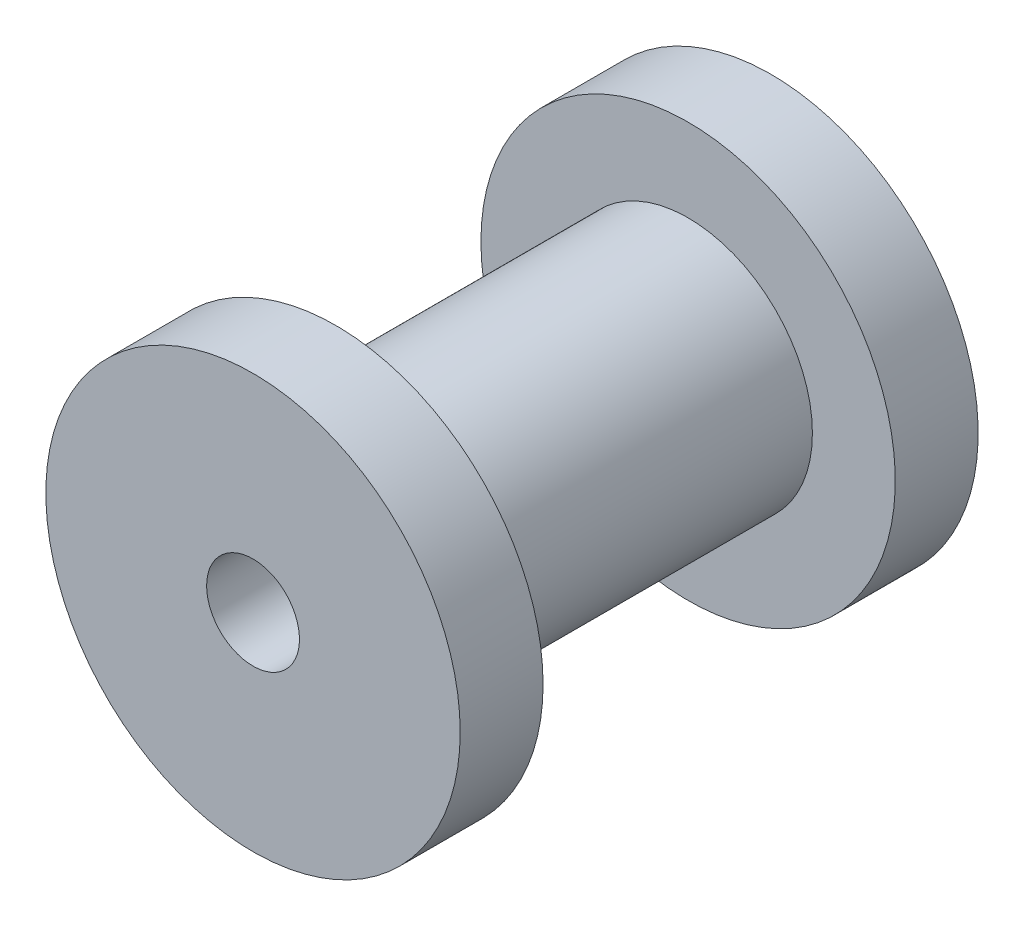
ISO-10303-21;
HEADER;
FILE_DESCRIPTION(('STEP AP214'),'2;1');
FILE_NAME('part.step','',(''),(''),'','','');
FILE_SCHEMA(('AUTOMOTIVE_DESIGN { 1 0 10303 214 1 1 1 1 }'));
ENDSEC;
DATA;
#1=APPLICATION_CONTEXT('core data for automotive mechanical design processes');
#2=APPLICATION_PROTOCOL_DEFINITION('international standard','automotive_design',2000,#1);
#3=PRODUCT_CONTEXT('',#1,'mechanical');
#4=PRODUCT('Part','Part','',(#3));
#5=PRODUCT_RELATED_PRODUCT_CATEGORY('part','',(#4));
#6=PRODUCT_DEFINITION_FORMATION('','',#4);
#7=PRODUCT_DEFINITION_CONTEXT('part definition',#1,'design');
#8=PRODUCT_DEFINITION('design','',#6,#7);
#9=PRODUCT_DEFINITION_SHAPE('','',#8);
#10=(LENGTH_UNIT() NAMED_UNIT(*) SI_UNIT(.MILLI.,.METRE.));
#11=(NAMED_UNIT(*) PLANE_ANGLE_UNIT() SI_UNIT($,.RADIAN.));
#12=(NAMED_UNIT(*) SI_UNIT($,.STERADIAN.) SOLID_ANGLE_UNIT());
#13=UNCERTAINTY_MEASURE_WITH_UNIT(LENGTH_MEASURE(1.E-05),#10,'distance_accuracy_value','');
#14=(GEOMETRIC_REPRESENTATION_CONTEXT(3) GLOBAL_UNCERTAINTY_ASSIGNED_CONTEXT((#13)) GLOBAL_UNIT_ASSIGNED_CONTEXT((#10,
#11,#12)) REPRESENTATION_CONTEXT('',''));
#15=CARTESIAN_POINT('',(0.,0.,0.));
#16=DIRECTION('',(0.,0.,1.));
#17=DIRECTION('',(1.,0.,0.));
#18=AXIS2_PLACEMENT_3D('',#15,#16,#17);
#19=CARTESIAN_POINT('',(0.,0.,26.9875));
#20=DIRECTION('',(0.,0.,-1.));
#21=DIRECTION('',(-1.,0.,0.));
#22=AXIS2_PLACEMENT_3D('',#19,#20,#21);
#23=CYLINDRICAL_SURFACE('',#22,9.525);
#24=CARTESIAN_POINT('',(0.,0.,26.9875));
#25=DIRECTION('',(0.,0.,1.));
#26=DIRECTION('',(1.,0.,0.));
#27=AXIS2_PLACEMENT_3D('',#24,#25,#26);
#28=CIRCLE('',#27,9.525);
#29=CARTESIAN_POINT('',(9.525,0.,26.9875));
#30=VERTEX_POINT('',#29);
#31=EDGE_CURVE('E10',#30,#30,#28,.T.);
#32=ORIENTED_EDGE('',*,*,#31,.F.);
#33=EDGE_LOOP('',(#32));
#34=FACE_BOUND('',#33,.T.);
#35=CARTESIAN_POINT('',(0.,0.,0.));
#36=DIRECTION('',(0.,0.,1.));
#37=DIRECTION('',(1.,0.,0.));
#38=AXIS2_PLACEMENT_3D('',#35,#36,#37);
#39=CIRCLE('',#38,9.525);
#40=CARTESIAN_POINT('',(9.525,0.,0.));
#41=VERTEX_POINT('',#40);
#42=EDGE_CURVE('E40',#41,#41,#39,.T.);
#43=ORIENTED_EDGE('',*,*,#42,.T.);
#44=EDGE_LOOP('',(#43));
#45=FACE_BOUND('',#44,.T.);
#46=ADVANCED_FACE('F37',(#34,#45),#23,.T.);
#47=CARTESIAN_POINT('',(0.,0.,33.3375));
#48=DIRECTION('',(0.,0.,-1.));
#49=DIRECTION('',(-1.,0.,0.));
#50=AXIS2_PLACEMENT_3D('',#47,#48,#49);
#51=CYLINDRICAL_SURFACE('',#50,15.875);
#52=CARTESIAN_POINT('',(0.,0.,33.3375));
#53=DIRECTION('',(0.,0.,1.));
#54=DIRECTION('',(1.,0.,0.));
#55=AXIS2_PLACEMENT_3D('',#52,#53,#54);
#56=CIRCLE('',#55,15.875);
#57=CARTESIAN_POINT('',(15.875,0.,33.3375));
#58=VERTEX_POINT('',#57);
#59=EDGE_CURVE('E45',#58,#58,#56,.T.);
#60=ORIENTED_EDGE('',*,*,#59,.F.);
#61=EDGE_LOOP('',(#60));
#62=FACE_BOUND('',#61,.T.);
#63=CARTESIAN_POINT('',(0.,0.,26.9875));
#64=DIRECTION('',(0.,0.,1.));
#65=DIRECTION('',(1.,0.,0.));
#66=AXIS2_PLACEMENT_3D('',#63,#64,#65);
#67=CIRCLE('',#66,15.875);
#68=CARTESIAN_POINT('',(15.875,0.,26.9875));
#69=VERTEX_POINT('',#68);
#70=EDGE_CURVE('E50',#69,#69,#67,.T.);
#71=ORIENTED_EDGE('',*,*,#70,.T.);
#72=EDGE_LOOP('',(#71));
#73=FACE_BOUND('',#72,.T.);
#74=ADVANCED_FACE('F103',(#62,#73),#51,.T.);
#75=CARTESIAN_POINT('',(0.,0.,33.3375));
#76=DIRECTION('',(0.,0.,1.));
#77=DIRECTION('',(1.,0.,0.));
#78=AXIS2_PLACEMENT_3D('',#75,#76,#77);
#79=PLANE('',#78);
#80=CARTESIAN_POINT('',(0.,0.,33.3375));
#81=DIRECTION('',(0.,0.,-1.));
#82=DIRECTION('',(-1.,0.,0.));
#83=AXIS2_PLACEMENT_3D('',#80,#81,#82);
#84=CIRCLE('',#83,3.556);
#85=CARTESIAN_POINT('',(-3.556,0.,33.3375));
#86=VERTEX_POINT('',#85);
#87=EDGE_CURVE('E61',#86,#86,#84,.T.);
#88=ORIENTED_EDGE('',*,*,#87,.T.);
#89=EDGE_LOOP('',(#88));
#90=FACE_BOUND('',#89,.T.);
#91=ORIENTED_EDGE('',*,*,#59,.T.);
#92=EDGE_LOOP('',(#91));
#93=FACE_BOUND('',#92,.T.);
#94=ADVANCED_FACE('F73',(#90,#93),#79,.T.);
#95=CARTESIAN_POINT('',(0.,0.,26.9875));
#96=DIRECTION('',(0.,0.,1.));
#97=DIRECTION('',(1.,0.,0.));
#98=AXIS2_PLACEMENT_3D('',#95,#96,#97);
#99=PLANE('',#98);
#100=ORIENTED_EDGE('',*,*,#31,.T.);
#101=EDGE_LOOP('',(#100));
#102=FACE_BOUND('',#101,.T.);
#103=ORIENTED_EDGE('',*,*,#70,.F.);
#104=EDGE_LOOP('',(#103));
#105=FACE_BOUND('',#104,.T.);
#106=ADVANCED_FACE('F92',(#102,#105),#99,.F.);
#107=CARTESIAN_POINT('',(0.,0.,-6.35));
#108=DIRECTION('',(0.,0.,1.));
#109=DIRECTION('',(1.,0.,0.));
#110=AXIS2_PLACEMENT_3D('',#107,#108,#109);
#111=CYLINDRICAL_SURFACE('',#110,15.875);
#112=CARTESIAN_POINT('',(0.,0.,-6.35));
#113=DIRECTION('',(0.,0.,-1.));
#114=DIRECTION('',(-1.,0.,0.));
#115=AXIS2_PLACEMENT_3D('',#112,#113,#114);
#116=CIRCLE('',#115,15.875);
#117=CARTESIAN_POINT('',(-15.875,0.,-6.35));
#118=VERTEX_POINT('',#117);
#119=EDGE_CURVE('E60',#118,#118,#116,.T.);
#120=ORIENTED_EDGE('',*,*,#119,.F.);
#121=EDGE_LOOP('',(#120));
#122=FACE_BOUND('',#121,.T.);
#123=CARTESIAN_POINT('',(0.,0.,0.));
#124=DIRECTION('',(0.,0.,-1.));
#125=DIRECTION('',(-1.,0.,0.));
#126=AXIS2_PLACEMENT_3D('',#123,#124,#125);
#127=CIRCLE('',#126,15.875);
#128=CARTESIAN_POINT('',(-15.875,0.,0.));
#129=VERTEX_POINT('',#128);
#130=EDGE_CURVE('E56',#129,#129,#127,.T.);
#131=ORIENTED_EDGE('',*,*,#130,.T.);
#132=EDGE_LOOP('',(#131));
#133=FACE_BOUND('',#132,.T.);
#134=ADVANCED_FACE('F86',(#122,#133),#111,.T.);
#135=CARTESIAN_POINT('',(0.,0.,-6.35));
#136=DIRECTION('',(0.,0.,-1.));
#137=DIRECTION('',(-1.,0.,0.));
#138=AXIS2_PLACEMENT_3D('',#135,#136,#137);
#139=PLANE('',#138);
#140=CARTESIAN_POINT('',(0.,0.,-6.35));
#141=DIRECTION('',(0.,0.,-1.));
#142=DIRECTION('',(-1.,0.,0.));
#143=AXIS2_PLACEMENT_3D('',#140,#141,#142);
#144=CIRCLE('',#143,3.556);
#145=CARTESIAN_POINT('',(-3.556,0.,-6.34999999999999));
#146=VERTEX_POINT('',#145);
#147=EDGE_CURVE('E65',#146,#146,#144,.T.);
#148=ORIENTED_EDGE('',*,*,#147,.F.);
#149=EDGE_LOOP('',(#148));
#150=FACE_BOUND('',#149,.T.);
#151=ORIENTED_EDGE('',*,*,#119,.T.);
#152=EDGE_LOOP('',(#151));
#153=FACE_BOUND('',#152,.T.);
#154=ADVANCED_FACE('F83',(#150,#153),#139,.T.);
#155=CARTESIAN_POINT('',(0.,0.,0.));
#156=DIRECTION('',(0.,0.,-1.));
#157=DIRECTION('',(-1.,0.,0.));
#158=AXIS2_PLACEMENT_3D('',#155,#156,#157);
#159=PLANE('',#158);
#160=ORIENTED_EDGE('',*,*,#42,.F.);
#161=EDGE_LOOP('',(#160));
#162=FACE_BOUND('',#161,.T.);
#163=ORIENTED_EDGE('',*,*,#130,.F.);
#164=EDGE_LOOP('',(#163));
#165=FACE_BOUND('',#164,.T.);
#166=ADVANCED_FACE('F79',(#162,#165),#159,.F.);
#167=CARTESIAN_POINT('',(0.,0.,33.3375));
#168=DIRECTION('',(0.,0.,-1.));
#169=DIRECTION('',(-1.,0.,0.));
#170=AXIS2_PLACEMENT_3D('',#167,#168,#169);
#171=CYLINDRICAL_SURFACE('',#170,3.556);
#172=CARTESIAN_POINT('',(-3.556,0.,33.3375));
#173=CARTESIAN_POINT('',(-3.556,0.,32.9240885416667));
#174=CARTESIAN_POINT('',(-3.556,0.,32.5106770833333));
#175=CARTESIAN_POINT('',(-3.556,0.,31.6838541666667));
#176=CARTESIAN_POINT('',(-3.556,0.,31.2704427083333));
#177=CARTESIAN_POINT('',(-3.556,0.,30.4436197916667));
#178=CARTESIAN_POINT('',(-3.556,0.,30.0302083333333));
#179=CARTESIAN_POINT('',(-3.556,0.,29.2033854166667));
#180=CARTESIAN_POINT('',(-3.556,0.,28.7899739583333));
#181=CARTESIAN_POINT('',(-3.556,0.,27.9631510416667));
#182=CARTESIAN_POINT('',(-3.556,0.,27.5497395833333));
#183=CARTESIAN_POINT('',(-3.556,0.,26.7229166666667));
#184=CARTESIAN_POINT('',(-3.556,0.,26.3095052083333));
#185=CARTESIAN_POINT('',(-3.556,0.,25.4826822916667));
#186=CARTESIAN_POINT('',(-3.556,0.,25.0692708333333));
#187=CARTESIAN_POINT('',(-3.556,0.,24.2424479166667));
#188=CARTESIAN_POINT('',(-3.556,0.,23.8290364583333));
#189=CARTESIAN_POINT('',(-3.556,0.,23.0022135416667));
#190=CARTESIAN_POINT('',(-3.556,0.,22.5888020833333));
#191=CARTESIAN_POINT('',(-3.556,0.,21.7619791666667));
#192=CARTESIAN_POINT('',(-3.556,0.,21.3485677083333));
#193=CARTESIAN_POINT('',(-3.556,0.,20.5217447916667));
#194=CARTESIAN_POINT('',(-3.556,0.,20.1083333333333));
#195=CARTESIAN_POINT('',(-3.556,0.,19.2815104166667));
#196=CARTESIAN_POINT('',(-3.556,0.,18.8680989583333));
#197=CARTESIAN_POINT('',(-3.556,0.,18.0412760416667));
#198=CARTESIAN_POINT('',(-3.556,0.,17.6278645833333));
#199=CARTESIAN_POINT('',(-3.556,0.,16.8010416666667));
#200=CARTESIAN_POINT('',(-3.556,0.,16.3876302083333));
#201=CARTESIAN_POINT('',(-3.556,0.,15.5608072916667));
#202=CARTESIAN_POINT('',(-3.556,0.,15.1473958333333));
#203=CARTESIAN_POINT('',(-3.556,0.,14.3205729166667));
#204=CARTESIAN_POINT('',(-3.556,0.,13.9071614583333));
#205=CARTESIAN_POINT('',(-3.556,0.,13.0803385416667));
#206=CARTESIAN_POINT('',(-3.556,0.,12.6669270833333));
#207=CARTESIAN_POINT('',(-3.556,0.,11.8401041666667));
#208=CARTESIAN_POINT('',(-3.556,0.,11.4266927083333));
#209=CARTESIAN_POINT('',(-3.556,0.,10.5998697916667));
#210=CARTESIAN_POINT('',(-3.556,0.,10.1864583333333));
#211=CARTESIAN_POINT('',(-3.556,0.,9.35963541666667));
#212=CARTESIAN_POINT('',(-3.556,0.,8.94622395833334));
#213=CARTESIAN_POINT('',(-3.556,0.,8.11940104166667));
#214=CARTESIAN_POINT('',(-3.556,0.,7.70598958333334));
#215=CARTESIAN_POINT('',(-3.556,0.,6.87916666666667));
#216=CARTESIAN_POINT('',(-3.556,0.,6.46575520833334));
#217=CARTESIAN_POINT('',(-3.556,0.,5.63893229166667));
#218=CARTESIAN_POINT('',(-3.556,0.,5.22552083333334));
#219=CARTESIAN_POINT('',(-3.556,0.,4.39869791666667));
#220=CARTESIAN_POINT('',(-3.556,0.,3.98528645833334));
#221=CARTESIAN_POINT('',(-3.556,0.,3.15846354166667));
#222=CARTESIAN_POINT('',(-3.556,0.,2.74505208333334));
#223=CARTESIAN_POINT('',(-3.556,0.,1.91822916666667));
#224=CARTESIAN_POINT('',(-3.556,0.,1.50481770833334));
#225=CARTESIAN_POINT('',(-3.556,0.,0.677994791666671));
#226=CARTESIAN_POINT('',(-3.556,0.,0.264583333333339));
#227=CARTESIAN_POINT('',(-3.556,0.,-0.562239583333328));
#228=CARTESIAN_POINT('',(-3.556,0.,-0.975651041666662));
#229=CARTESIAN_POINT('',(-3.556,0.,-1.80247395833333));
#230=CARTESIAN_POINT('',(-3.556,0.,-2.21588541666666));
#231=CARTESIAN_POINT('',(-3.556,0.,-3.04270833333333));
#232=CARTESIAN_POINT('',(-3.556,0.,-3.45611979166666));
#233=CARTESIAN_POINT('',(-3.556,0.,-4.28294270833333));
#234=CARTESIAN_POINT('',(-3.556,0.,-4.69635416666666));
#235=CARTESIAN_POINT('',(-3.556,0.,-5.52317708333333));
#236=CARTESIAN_POINT('',(-3.556,0.,-5.93658854166666));
#237=CARTESIAN_POINT('',(-3.556,0.,-6.34999999999999));
#238=B_SPLINE_CURVE_WITH_KNOTS('',3,(#172,#173,#174,#175,#176,#177,#178,#179,#180,#181,#182,
#183,#184,#185,#186,#187,#188,#189,#190,#191,#192,#193,#194,#195,#196,#197,#198,#199,#200,#201,
#202,#203,#204,#205,#206,#207,#208,#209,#210,#211,#212,#213,#214,#215,#216,#217,#218,#219,#220,
#221,#222,#223,#224,#225,#226,#227,#228,#229,#230,#231,#232,#233,#234,#235,#236,#237),
.UNSPECIFIED.,.F.,.F.,(4,2,2,2,2,2,2,2,2,2,2,2,2,2,2,2,2,2,2,2,2,2,2,2,2,2,2,2,2,2,2,2,4),(0.,
1.240234375,2.48046875,3.720703125,4.96093749999999,6.20117187499999,7.44140625,
8.68164062499999,9.921875,11.162109375,12.40234375,13.642578125,14.8828125,16.123046875,
17.36328125,18.603515625,19.84375,21.083984375,22.32421875,23.564453125,24.8046875,26.044921875,
27.28515625,28.525390625,29.765625,31.005859375,32.24609375,33.486328125,34.7265625,
35.966796875,37.20703125,38.447265625,39.6875),.UNSPECIFIED.);
#239=EDGE_CURVE('BSEAM76',#86,#146,#238,.T.);
#240=ORIENTED_EDGE('',*,*,#87,.F.);
#241=ORIENTED_EDGE('',*,*,#147,.T.);
#242=ORIENTED_EDGE('',*,*,#239,.T.);
#243=ORIENTED_EDGE('',*,*,#239,.F.);
#244=EDGE_LOOP('',(#240,#242,#241,#243));
#245=FACE_BOUND('',#244,.T.);
#246=ADVANCED_FACE('F76',(#245),#171,.F.);
#247=CLOSED_SHELL('',(#46,#74,#94,#106,#134,#154,#166,#246));
#248=MANIFOLD_SOLID_BREP('B2',#247);
#249=ADVANCED_BREP_SHAPE_REPRESENTATION('',(#18,#248),#14);
#250=SHAPE_DEFINITION_REPRESENTATION(#9,#249);
ENDSEC;
END-ISO-10303-21;
